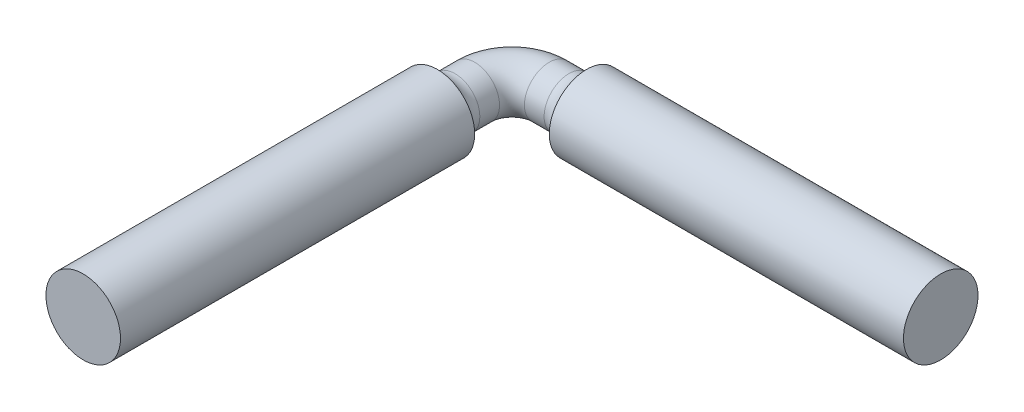
ISO-10303-21;
HEADER;
FILE_DESCRIPTION(('STEP AP214'),'2;1');
FILE_NAME('part.step','',(''),(''),'','','');
FILE_SCHEMA(('AUTOMOTIVE_DESIGN { 1 0 10303 214 1 1 1 1 }'));
ENDSEC;
DATA;
#1=APPLICATION_CONTEXT('core data for automotive mechanical design processes');
#2=APPLICATION_PROTOCOL_DEFINITION('international standard','automotive_design',2000,#1);
#3=PRODUCT_CONTEXT('',#1,'mechanical');
#4=PRODUCT('Part','Part','',(#3));
#5=PRODUCT_RELATED_PRODUCT_CATEGORY('part','',(#4));
#6=PRODUCT_DEFINITION_FORMATION('','',#4);
#7=PRODUCT_DEFINITION_CONTEXT('part definition',#1,'design');
#8=PRODUCT_DEFINITION('design','',#6,#7);
#9=PRODUCT_DEFINITION_SHAPE('','',#8);
#10=(LENGTH_UNIT() NAMED_UNIT(*) SI_UNIT(.MILLI.,.METRE.));
#11=(NAMED_UNIT(*) PLANE_ANGLE_UNIT() SI_UNIT($,.RADIAN.));
#12=(NAMED_UNIT(*) SI_UNIT($,.STERADIAN.) SOLID_ANGLE_UNIT());
#13=UNCERTAINTY_MEASURE_WITH_UNIT(LENGTH_MEASURE(1.E-05),#10,'distance_accuracy_value','');
#14=(GEOMETRIC_REPRESENTATION_CONTEXT(3) GLOBAL_UNCERTAINTY_ASSIGNED_CONTEXT((#13)) GLOBAL_UNIT_ASSIGNED_CONTEXT((#10,
#11,#12)) REPRESENTATION_CONTEXT('',''));
#15=CARTESIAN_POINT('',(0.,0.,0.));
#16=DIRECTION('',(0.,0.,1.));
#17=DIRECTION('',(1.,0.,0.));
#18=AXIS2_PLACEMENT_3D('',#15,#16,#17);
#19=CARTESIAN_POINT('',(3.,0.,-34.5));
#20=DIRECTION('',(1.,0.,0.));
#21=DIRECTION('',(0.,0.,-1.));
#22=AXIS2_PLACEMENT_3D('',#19,#20,#21);
#23=CYLINDRICAL_SURFACE('',#22,2.);
#24=CARTESIAN_POINT('',(4.58578643762691,0.,-34.5));
#25=DIRECTION('',(1.,0.,0.));
#26=DIRECTION('',(0.,0.,-1.));
#27=AXIS2_PLACEMENT_3D('',#24,#25,#26);
#28=CIRCLE('',#27,2.);
#29=CARTESIAN_POINT('',(4.58578643762691,0.,-36.5));
#30=VERTEX_POINT('',#29);
#31=EDGE_CURVE('E10',#30,#30,#28,.F.);
#32=ORIENTED_EDGE('',*,*,#31,.T.);
#33=EDGE_LOOP('',(#32));
#34=FACE_BOUND('',#33,.T.);
#35=CARTESIAN_POINT('',(3.,0.,-34.5));
#36=DIRECTION('',(-1.,0.,0.));
#37=DIRECTION('',(0.,0.,1.));
#38=AXIS2_PLACEMENT_3D('',#35,#36,#37);
#39=CIRCLE('',#38,2.);
#40=CARTESIAN_POINT('',(3.,0.,-36.5));
#41=VERTEX_POINT('',#40);
#42=EDGE_CURVE('E42',#41,#41,#39,.T.);
#43=ORIENTED_EDGE('',*,*,#42,.F.);
#44=EDGE_LOOP('',(#43));
#45=FACE_BOUND('',#44,.T.);
#46=ADVANCED_FACE('F31',(#34,#45),#23,.T.);
#47=CARTESIAN_POINT('',(0.,0.,0.));
#48=DIRECTION('',(0.,0.,-1.));
#49=DIRECTION('',(-1.,0.,0.));
#50=AXIS2_PLACEMENT_3D('',#47,#48,#49);
#51=CYLINDRICAL_SURFACE('',#50,2.);
#52=CARTESIAN_POINT('',(0.,0.,-29.9142135623731));
#53=DIRECTION('',(0.,0.,1.));
#54=DIRECTION('',(1.,0.,0.));
#55=AXIS2_PLACEMENT_3D('',#52,#53,#54);
#56=CIRCLE('',#55,2.);
#57=CARTESIAN_POINT('',(2.,0.,-29.9142135623731));
#58=VERTEX_POINT('',#57);
#59=EDGE_CURVE('E38',#58,#58,#56,.F.);
#60=ORIENTED_EDGE('',*,*,#59,.T.);
#61=EDGE_LOOP('',(#60));
#62=FACE_BOUND('',#61,.T.);
#63=CARTESIAN_POINT('',(0.,0.,-31.5));
#64=DIRECTION('',(0.,0.,1.));
#65=DIRECTION('',(1.,0.,0.));
#66=AXIS2_PLACEMENT_3D('',#63,#64,#65);
#67=CIRCLE('',#66,2.);
#68=CARTESIAN_POINT('',(-2.,0.,-31.5));
#69=VERTEX_POINT('',#68);
#70=EDGE_CURVE('E46',#69,#69,#67,.T.);
#71=ORIENTED_EDGE('',*,*,#70,.T.);
#72=EDGE_LOOP('',(#71));
#73=FACE_BOUND('',#72,.T.);
#74=ADVANCED_FACE('F76',(#62,#73),#51,.T.);
#75=CARTESIAN_POINT('',(3.,0.,-31.5));
#76=DIRECTION('',(0.,-1.,0.));
#77=DIRECTION('',(0.,0.,-1.));
#78=AXIS2_PLACEMENT_3D('',#75,#76,#77);
#79=TOROIDAL_SURFACE('',#78,3.,2.);
#80=CARTESIAN_POINT('',(3.,0.,-31.5));
#81=DIRECTION('',(0.,-1.,0.));
#82=DIRECTION('',(0.,0.,-1.));
#83=AXIS2_PLACEMENT_3D('',#80,#81,#82);
#84=CIRCLE('',#83,5.);
#85=EDGE_CURVE('',#69,#41,#84,.T.);
#86=ORIENTED_EDGE('',*,*,#70,.F.);
#87=ORIENTED_EDGE('',*,*,#42,.T.);
#88=ORIENTED_EDGE('',*,*,#85,.T.);
#89=ORIENTED_EDGE('',*,*,#85,.F.);
#90=EDGE_LOOP('',(#86,#88,#87,#89));
#91=FACE_BOUND('',#90,.T.);
#92=ADVANCED_FACE('F81',(#91),#79,.T.);
#93=CARTESIAN_POINT('',(0.,0.,-28.5));
#94=DIRECTION('',(0.,0.,1.));
#95=DIRECTION('',(1.,0.,0.));
#96=AXIS2_PLACEMENT_3D('',#93,#94,#95);
#97=CYLINDRICAL_SURFACE('',#96,3.);
#98=CARTESIAN_POINT('',(0.,0.,-28.5));
#99=DIRECTION('',(0.,0.,1.));
#100=DIRECTION('',(1.,0.,0.));
#101=AXIS2_PLACEMENT_3D('',#98,#99,#100);
#102=CIRCLE('',#101,3.);
#103=CARTESIAN_POINT('',(3.,0.,-28.5));
#104=VERTEX_POINT('',#103);
#105=EDGE_CURVE('E51',#104,#104,#102,.T.);
#106=CARTESIAN_POINT('',(0.,0.,0.));
#107=DIRECTION('',(0.,0.,1.));
#108=DIRECTION('',(1.,0.,0.));
#109=AXIS2_PLACEMENT_3D('',#106,#107,#108);
#110=CIRCLE('',#109,3.);
#111=CARTESIAN_POINT('',(3.,0.,0.));
#112=VERTEX_POINT('',#111);
#113=EDGE_CURVE('E52',#112,#112,#110,.T.);
#114=CARTESIAN_POINT('',(3.,0.,-28.5));
#115=CARTESIAN_POINT('',(3.,0.,-28.203125));
#116=CARTESIAN_POINT('',(3.,0.,-27.90625));
#117=CARTESIAN_POINT('',(3.,0.,-27.3125));
#118=CARTESIAN_POINT('',(3.,0.,-27.015625));
#119=CARTESIAN_POINT('',(3.,0.,-26.421875));
#120=CARTESIAN_POINT('',(3.,0.,-26.125));
#121=CARTESIAN_POINT('',(3.,0.,-25.53125));
#122=CARTESIAN_POINT('',(3.,0.,-25.234375));
#123=CARTESIAN_POINT('',(3.,0.,-24.640625));
#124=CARTESIAN_POINT('',(3.,0.,-24.34375));
#125=CARTESIAN_POINT('',(3.,0.,-23.75));
#126=CARTESIAN_POINT('',(3.,0.,-23.453125));
#127=CARTESIAN_POINT('',(3.,0.,-22.859375));
#128=CARTESIAN_POINT('',(3.,0.,-22.5625));
#129=CARTESIAN_POINT('',(3.,0.,-21.96875));
#130=CARTESIAN_POINT('',(3.,0.,-21.671875));
#131=CARTESIAN_POINT('',(3.,0.,-21.078125));
#132=CARTESIAN_POINT('',(3.,0.,-20.78125));
#133=CARTESIAN_POINT('',(3.,0.,-20.1875));
#134=CARTESIAN_POINT('',(3.,0.,-19.890625));
#135=CARTESIAN_POINT('',(3.,0.,-19.296875));
#136=CARTESIAN_POINT('',(3.,0.,-19.));
#137=CARTESIAN_POINT('',(3.,0.,-18.40625));
#138=CARTESIAN_POINT('',(3.,0.,-18.109375));
#139=CARTESIAN_POINT('',(3.,0.,-17.515625));
#140=CARTESIAN_POINT('',(3.,0.,-17.21875));
#141=CARTESIAN_POINT('',(3.,0.,-16.625));
#142=CARTESIAN_POINT('',(3.,0.,-16.328125));
#143=CARTESIAN_POINT('',(3.,0.,-15.734375));
#144=CARTESIAN_POINT('',(3.,0.,-15.4375));
#145=CARTESIAN_POINT('',(3.,0.,-14.84375));
#146=CARTESIAN_POINT('',(3.,0.,-14.546875));
#147=CARTESIAN_POINT('',(3.,0.,-13.953125));
#148=CARTESIAN_POINT('',(3.,0.,-13.65625));
#149=CARTESIAN_POINT('',(3.,0.,-13.0625));
#150=CARTESIAN_POINT('',(3.,0.,-12.765625));
#151=CARTESIAN_POINT('',(3.,0.,-12.171875));
#152=CARTESIAN_POINT('',(3.,0.,-11.875));
#153=CARTESIAN_POINT('',(3.,0.,-11.28125));
#154=CARTESIAN_POINT('',(3.,0.,-10.984375));
#155=CARTESIAN_POINT('',(3.,0.,-10.390625));
#156=CARTESIAN_POINT('',(3.,0.,-10.09375));
#157=CARTESIAN_POINT('',(3.,0.,-9.5));
#158=CARTESIAN_POINT('',(3.,0.,-9.203125));
#159=CARTESIAN_POINT('',(3.,0.,-8.609375));
#160=CARTESIAN_POINT('',(3.,0.,-8.3125));
#161=CARTESIAN_POINT('',(3.,0.,-7.71875));
#162=CARTESIAN_POINT('',(3.,0.,-7.421875));
#163=CARTESIAN_POINT('',(3.,0.,-6.828125));
#164=CARTESIAN_POINT('',(3.,0.,-6.53125));
#165=CARTESIAN_POINT('',(3.,0.,-5.9375));
#166=CARTESIAN_POINT('',(3.,0.,-5.640625));
#167=CARTESIAN_POINT('',(3.,0.,-5.046875));
#168=CARTESIAN_POINT('',(3.,0.,-4.75));
#169=CARTESIAN_POINT('',(3.,0.,-4.15625));
#170=CARTESIAN_POINT('',(3.,0.,-3.859375));
#171=CARTESIAN_POINT('',(3.,0.,-3.265625));
#172=CARTESIAN_POINT('',(3.,0.,-2.96875));
#173=CARTESIAN_POINT('',(3.,0.,-2.375));
#174=CARTESIAN_POINT('',(3.,0.,-2.078125));
#175=CARTESIAN_POINT('',(3.,0.,-1.484375));
#176=CARTESIAN_POINT('',(3.,0.,-1.1875));
#177=CARTESIAN_POINT('',(3.,0.,-0.593749999999999));
#178=CARTESIAN_POINT('',(3.,0.,-0.296875));
#179=CARTESIAN_POINT('',(3.,0.,0.));
#180=B_SPLINE_CURVE_WITH_KNOTS('',3,(#114,#115,#116,#117,#118,#119,#120,#121,#122,#123,#124,
#125,#126,#127,#128,#129,#130,#131,#132,#133,#134,#135,#136,#137,#138,#139,#140,#141,#142,#143,
#144,#145,#146,#147,#148,#149,#150,#151,#152,#153,#154,#155,#156,#157,#158,#159,#160,#161,#162,
#163,#164,#165,#166,#167,#168,#169,#170,#171,#172,#173,#174,#175,#176,#177,#178,#179),
.UNSPECIFIED.,.F.,.F.,(4,2,2,2,2,2,2,2,2,2,2,2,2,2,2,2,2,2,2,2,2,2,2,2,2,2,2,2,2,2,2,2,4),(0.,
0.890624999999999,1.78125,2.671875,3.5625,4.453125,5.34375,6.234375,7.125,8.015625,8.90625,
9.796875,10.6875,11.578125,12.46875,13.359375,14.25,15.140625,16.03125,16.921875,17.8125,
18.703125,19.59375,20.484375,21.375,22.265625,23.15625,24.046875,24.9375,25.828125,26.71875,
27.609375,28.5),.UNSPECIFIED.);
#181=EDGE_CURVE('BSEAM91',#104,#112,#180,.T.);
#182=ORIENTED_EDGE('',*,*,#105,.T.);
#183=ORIENTED_EDGE('',*,*,#113,.F.);
#184=ORIENTED_EDGE('',*,*,#181,.T.);
#185=ORIENTED_EDGE('',*,*,#181,.F.);
#186=EDGE_LOOP('',(#182,#184,#183,#185));
#187=FACE_BOUND('',#186,.T.);
#188=ADVANCED_FACE('F91',(#187),#97,.T.);
#189=CARTESIAN_POINT('',(0.,0.,0.));
#190=DIRECTION('',(0.,0.,1.));
#191=DIRECTION('',(1.,0.,0.));
#192=AXIS2_PLACEMENT_3D('',#189,#190,#191);
#193=PLANE('',#192);
#194=ORIENTED_EDGE('',*,*,#113,.T.);
#195=EDGE_LOOP('',(#194));
#196=FACE_BOUND('',#195,.T.);
#197=ADVANCED_FACE('F89',(#196),#193,.T.);
#198=CARTESIAN_POINT('',(6.,0.,-34.5));
#199=DIRECTION('',(1.,0.,0.));
#200=DIRECTION('',(0.,0.,-1.));
#201=AXIS2_PLACEMENT_3D('',#198,#199,#200);
#202=CYLINDRICAL_SURFACE('',#201,3.);
#203=CARTESIAN_POINT('',(6.,0.,-34.5));
#204=DIRECTION('',(1.,0.,0.));
#205=DIRECTION('',(0.,0.,-1.));
#206=AXIS2_PLACEMENT_3D('',#203,#204,#205);
#207=CIRCLE('',#206,3.);
#208=CARTESIAN_POINT('',(6.,0.,-37.5));
#209=VERTEX_POINT('',#208);
#210=EDGE_CURVE('E55',#209,#209,#207,.T.);
#211=CARTESIAN_POINT('',(34.5,0.,-34.5));
#212=DIRECTION('',(1.,0.,0.));
#213=DIRECTION('',(0.,0.,-1.));
#214=AXIS2_PLACEMENT_3D('',#211,#212,#213);
#215=CIRCLE('',#214,3.);
#216=CARTESIAN_POINT('',(34.5,0.,-37.5));
#217=VERTEX_POINT('',#216);
#218=EDGE_CURVE('E58',#217,#217,#215,.T.);
#219=CARTESIAN_POINT('',(6.,0.,-37.5));
#220=CARTESIAN_POINT('',(6.296875,0.,-37.5));
#221=CARTESIAN_POINT('',(6.59375,0.,-37.5));
#222=CARTESIAN_POINT('',(7.1875,0.,-37.5));
#223=CARTESIAN_POINT('',(7.484375,0.,-37.5));
#224=CARTESIAN_POINT('',(8.078125,0.,-37.5));
#225=CARTESIAN_POINT('',(8.375,0.,-37.5));
#226=CARTESIAN_POINT('',(8.96875,0.,-37.5));
#227=CARTESIAN_POINT('',(9.265625,0.,-37.5));
#228=CARTESIAN_POINT('',(9.859375,0.,-37.5));
#229=CARTESIAN_POINT('',(10.15625,0.,-37.5));
#230=CARTESIAN_POINT('',(10.75,0.,-37.5));
#231=CARTESIAN_POINT('',(11.046875,0.,-37.5));
#232=CARTESIAN_POINT('',(11.640625,0.,-37.5));
#233=CARTESIAN_POINT('',(11.9375,0.,-37.5));
#234=CARTESIAN_POINT('',(12.53125,0.,-37.5));
#235=CARTESIAN_POINT('',(12.828125,0.,-37.5));
#236=CARTESIAN_POINT('',(13.421875,0.,-37.5));
#237=CARTESIAN_POINT('',(13.71875,0.,-37.5));
#238=CARTESIAN_POINT('',(14.3125,0.,-37.5));
#239=CARTESIAN_POINT('',(14.609375,0.,-37.5));
#240=CARTESIAN_POINT('',(15.203125,0.,-37.5));
#241=CARTESIAN_POINT('',(15.5,0.,-37.5));
#242=CARTESIAN_POINT('',(16.09375,0.,-37.5));
#243=CARTESIAN_POINT('',(16.390625,0.,-37.5));
#244=CARTESIAN_POINT('',(16.984375,0.,-37.5));
#245=CARTESIAN_POINT('',(17.28125,0.,-37.5));
#246=CARTESIAN_POINT('',(17.875,0.,-37.5));
#247=CARTESIAN_POINT('',(18.171875,0.,-37.5));
#248=CARTESIAN_POINT('',(18.765625,0.,-37.5));
#249=CARTESIAN_POINT('',(19.0625,0.,-37.5));
#250=CARTESIAN_POINT('',(19.65625,0.,-37.5));
#251=CARTESIAN_POINT('',(19.953125,0.,-37.5));
#252=CARTESIAN_POINT('',(20.546875,0.,-37.5));
#253=CARTESIAN_POINT('',(20.84375,0.,-37.5));
#254=CARTESIAN_POINT('',(21.4375,0.,-37.5));
#255=CARTESIAN_POINT('',(21.734375,0.,-37.5));
#256=CARTESIAN_POINT('',(22.328125,0.,-37.5));
#257=CARTESIAN_POINT('',(22.625,0.,-37.5));
#258=CARTESIAN_POINT('',(23.21875,0.,-37.5));
#259=CARTESIAN_POINT('',(23.515625,0.,-37.5));
#260=CARTESIAN_POINT('',(24.109375,0.,-37.5));
#261=CARTESIAN_POINT('',(24.40625,0.,-37.5));
#262=CARTESIAN_POINT('',(25.,0.,-37.5));
#263=CARTESIAN_POINT('',(25.296875,0.,-37.5));
#264=CARTESIAN_POINT('',(25.890625,0.,-37.5));
#265=CARTESIAN_POINT('',(26.1875,0.,-37.5));
#266=CARTESIAN_POINT('',(26.78125,0.,-37.5));
#267=CARTESIAN_POINT('',(27.078125,0.,-37.5));
#268=CARTESIAN_POINT('',(27.671875,0.,-37.5));
#269=CARTESIAN_POINT('',(27.96875,0.,-37.5));
#270=CARTESIAN_POINT('',(28.5625,0.,-37.5));
#271=CARTESIAN_POINT('',(28.859375,0.,-37.5));
#272=CARTESIAN_POINT('',(29.453125,0.,-37.5));
#273=CARTESIAN_POINT('',(29.75,0.,-37.5));
#274=CARTESIAN_POINT('',(30.34375,0.,-37.5));
#275=CARTESIAN_POINT('',(30.640625,0.,-37.5));
#276=CARTESIAN_POINT('',(31.234375,0.,-37.5));
#277=CARTESIAN_POINT('',(31.53125,0.,-37.5));
#278=CARTESIAN_POINT('',(32.125,0.,-37.5));
#279=CARTESIAN_POINT('',(32.421875,0.,-37.5));
#280=CARTESIAN_POINT('',(33.015625,0.,-37.5));
#281=CARTESIAN_POINT('',(33.3125,0.,-37.5));
#282=CARTESIAN_POINT('',(33.90625,0.,-37.5));
#283=CARTESIAN_POINT('',(34.203125,0.,-37.5));
#284=CARTESIAN_POINT('',(34.5,0.,-37.5));
#285=B_SPLINE_CURVE_WITH_KNOTS('',3,(#219,#220,#221,#222,#223,#224,#225,#226,#227,#228,#229,
#230,#231,#232,#233,#234,#235,#236,#237,#238,#239,#240,#241,#242,#243,#244,#245,#246,#247,#248,
#249,#250,#251,#252,#253,#254,#255,#256,#257,#258,#259,#260,#261,#262,#263,#264,#265,#266,#267,
#268,#269,#270,#271,#272,#273,#274,#275,#276,#277,#278,#279,#280,#281,#282,#283,#284),
.UNSPECIFIED.,.F.,.F.,(4,2,2,2,2,2,2,2,2,2,2,2,2,2,2,2,2,2,2,2,2,2,2,2,2,2,2,2,2,2,2,2,4),(0.,
0.890624999999999,1.78125,2.671875,3.5625,4.453125,5.34375,6.234375,7.125,8.015625,8.90625,
9.796875,10.6875,11.578125,12.46875,13.359375,14.25,15.140625,16.03125,16.921875,17.8125,
18.703125,19.59375,20.484375,21.375,22.265625,23.15625,24.046875,24.9375,25.828125,26.71875,
27.609375,28.5),.UNSPECIFIED.);
#286=EDGE_CURVE('BSEAM64',#209,#217,#285,.T.);
#287=ORIENTED_EDGE('',*,*,#210,.T.);
#288=ORIENTED_EDGE('',*,*,#218,.F.);
#289=ORIENTED_EDGE('',*,*,#286,.T.);
#290=ORIENTED_EDGE('',*,*,#286,.F.);
#291=EDGE_LOOP('',(#287,#289,#288,#290));
#292=FACE_BOUND('',#291,.T.);
#293=ADVANCED_FACE('F64',(#292),#202,.T.);
#294=CARTESIAN_POINT('',(34.5,0.,-34.5));
#295=DIRECTION('',(-1.,0.,0.));
#296=DIRECTION('',(0.,0.,1.));
#297=AXIS2_PLACEMENT_3D('',#294,#295,#296);
#298=PLANE('',#297);
#299=ORIENTED_EDGE('',*,*,#218,.T.);
#300=EDGE_LOOP('',(#299));
#301=FACE_BOUND('',#300,.T.);
#302=ADVANCED_FACE('F73',(#301),#298,.F.);
#303=CARTESIAN_POINT('',(0.,0.,-29.9142135623731));
#304=DIRECTION('',(0.,0.,1.));
#305=DIRECTION('',(1.,0.,0.));
#306=AXIS2_PLACEMENT_3D('',#303,#304,#305);
#307=TOROIDAL_SURFACE('',#306,3.5,1.5);
#308=ORIENTED_EDGE('',*,*,#59,.F.);
#309=EDGE_LOOP('',(#308));
#310=FACE_BOUND('',#309,.T.);
#311=ORIENTED_EDGE('',*,*,#105,.F.);
#312=EDGE_LOOP('',(#311));
#313=FACE_BOUND('',#312,.T.);
#314=ADVANCED_FACE('F68',(#310,#313),#307,.F.);
#315=CARTESIAN_POINT('',(4.58578643762691,0.,-34.5));
#316=DIRECTION('',(1.,0.,0.));
#317=DIRECTION('',(0.,0.,-1.));
#318=AXIS2_PLACEMENT_3D('',#315,#316,#317);
#319=TOROIDAL_SURFACE('',#318,3.5,1.5);
#320=ORIENTED_EDGE('',*,*,#31,.F.);
#321=EDGE_LOOP('',(#320));
#322=FACE_BOUND('',#321,.T.);
#323=ORIENTED_EDGE('',*,*,#210,.F.);
#324=EDGE_LOOP('',(#323));
#325=FACE_BOUND('',#324,.T.);
#326=ADVANCED_FACE('F33',(#322,#325),#319,.F.);
#327=CLOSED_SHELL('',(#46,#74,#92,#188,#197,#293,#302,#314,#326));
#328=MANIFOLD_SOLID_BREP('B2',#327);
#329=ADVANCED_BREP_SHAPE_REPRESENTATION('',(#18,#328),#14);
#330=SHAPE_DEFINITION_REPRESENTATION(#9,#329);
ENDSEC;
END-ISO-10303-21;
